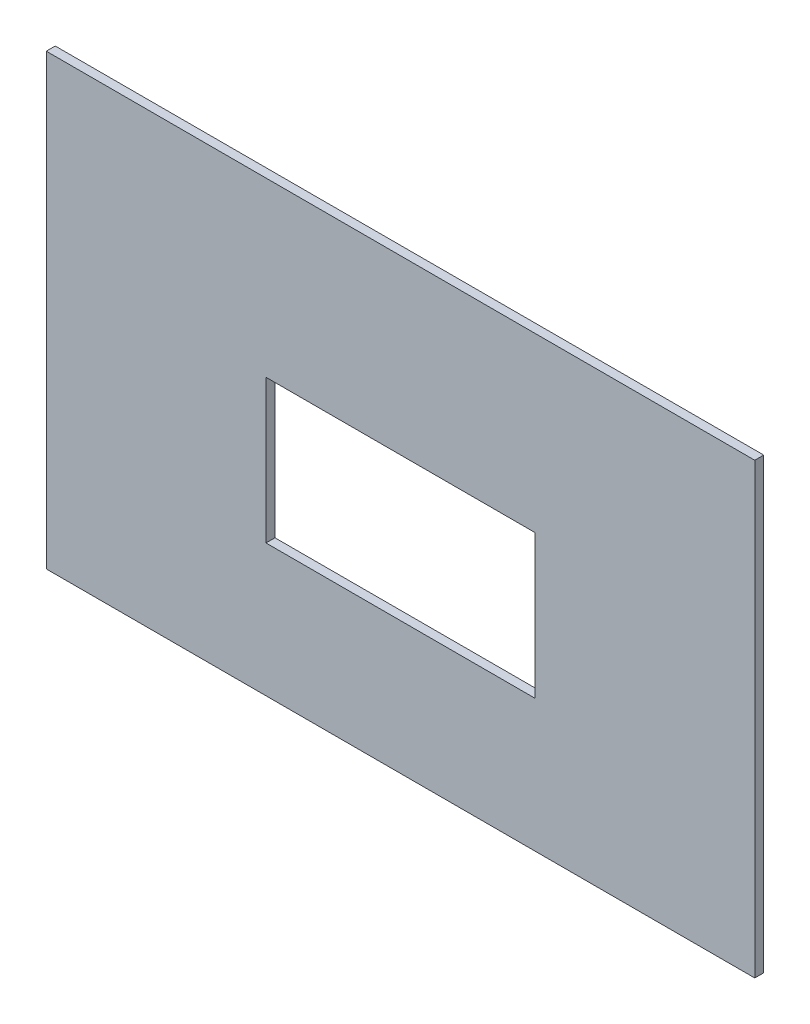
ISO-10303-21;
HEADER;
FILE_DESCRIPTION(('STEP AP214'),'2;1');
FILE_NAME('part.step','',(''),(''),'','','');
FILE_SCHEMA(('AUTOMOTIVE_DESIGN { 1 0 10303 214 1 1 1 1 }'));
ENDSEC;
DATA;
#1=APPLICATION_CONTEXT('core data for automotive mechanical design processes');
#2=APPLICATION_PROTOCOL_DEFINITION('international standard','automotive_design',2000,#1);
#3=PRODUCT_CONTEXT('',#1,'mechanical');
#4=PRODUCT('Part','Part','',(#3));
#5=PRODUCT_RELATED_PRODUCT_CATEGORY('part','',(#4));
#6=PRODUCT_DEFINITION_FORMATION('','',#4);
#7=PRODUCT_DEFINITION_CONTEXT('part definition',#1,'design');
#8=PRODUCT_DEFINITION('design','',#6,#7);
#9=PRODUCT_DEFINITION_SHAPE('','',#8);
#10=(LENGTH_UNIT() NAMED_UNIT(*) SI_UNIT(.MILLI.,.METRE.));
#11=(NAMED_UNIT(*) PLANE_ANGLE_UNIT() SI_UNIT($,.RADIAN.));
#12=(NAMED_UNIT(*) SI_UNIT($,.STERADIAN.) SOLID_ANGLE_UNIT());
#13=UNCERTAINTY_MEASURE_WITH_UNIT(LENGTH_MEASURE(1.E-05),#10,'distance_accuracy_value','');
#14=(GEOMETRIC_REPRESENTATION_CONTEXT(3) GLOBAL_UNCERTAINTY_ASSIGNED_CONTEXT((#13)) GLOBAL_UNIT_ASSIGNED_CONTEXT((#10,
#11,#12)) REPRESENTATION_CONTEXT('',''));
#15=CARTESIAN_POINT('',(0.,0.,0.));
#16=DIRECTION('',(0.,0.,1.));
#17=DIRECTION('',(1.,0.,0.));
#18=AXIS2_PLACEMENT_3D('',#15,#16,#17);
#19=CARTESIAN_POINT('',(-405.47263681592,195.273631840796,10.));
#20=DIRECTION('',(1.,0.,0.));
#21=DIRECTION('',(0.,0.,-1.));
#22=AXIS2_PLACEMENT_3D('',#19,#20,#21);
#23=PLANE('',#22);
#24=DIRECTION('',(0.,-1.,0.));
#25=VECTOR('',#24,1.);
#26=CARTESIAN_POINT('',(-405.47263681592,195.273631840796,0.));
#27=LINE('',#26,#25);
#28=CARTESIAN_POINT('',(-405.47263681592,195.273631840796,0.));
#29=VERTEX_POINT('',#28);
#30=CARTESIAN_POINT('',(-405.47263681592,-304.726368159204,0.));
#31=VERTEX_POINT('',#30);
#32=EDGE_CURVE('E147',#29,#31,#27,.T.);
#33=ORIENTED_EDGE('',*,*,#32,.T.);
#34=DIRECTION('',(0.,0.,-1.));
#35=VECTOR('',#34,1.);
#36=CARTESIAN_POINT('',(-405.47263681592,-304.726368159204,10.));
#37=LINE('',#36,#35);
#38=CARTESIAN_POINT('',(-405.47263681592,-304.726368159204,10.));
#39=VERTEX_POINT('',#38);
#40=EDGE_CURVE('E11',#39,#31,#37,.T.);
#41=ORIENTED_EDGE('',*,*,#40,.F.);
#42=DIRECTION('',(0.,-1.,0.));
#43=VECTOR('',#42,1.);
#44=CARTESIAN_POINT('',(-405.47263681592,195.273631840796,10.));
#45=LINE('',#44,#43);
#46=CARTESIAN_POINT('',(-405.47263681592,195.273631840796,10.));
#47=VERTEX_POINT('',#46);
#48=EDGE_CURVE('E153',#47,#39,#45,.T.);
#49=ORIENTED_EDGE('',*,*,#48,.F.);
#50=DIRECTION('',(0.,0.,-1.));
#51=VECTOR('',#50,1.);
#52=CARTESIAN_POINT('',(-405.47263681592,195.273631840796,10.));
#53=LINE('',#52,#51);
#54=EDGE_CURVE('E167',#47,#29,#53,.T.);
#55=ORIENTED_EDGE('',*,*,#54,.T.);
#56=EDGE_LOOP('',(#33,#41,#49,#55));
#57=FACE_BOUND('',#56,.T.);
#58=ADVANCED_FACE('F39',(#57),#23,.F.);
#59=CARTESIAN_POINT('',(-405.47263681592,-304.726368159204,10.));
#60=DIRECTION('',(0.,1.,0.));
#61=DIRECTION('',(-1.,0.,0.));
#62=AXIS2_PLACEMENT_3D('',#59,#60,#61);
#63=PLANE('',#62);
#64=DIRECTION('',(1.,0.,0.));
#65=VECTOR('',#64,1.);
#66=CARTESIAN_POINT('',(-405.47263681592,-304.726368159204,0.));
#67=LINE('',#66,#65);
#68=CARTESIAN_POINT('',(384.52736318408,-304.726368159204,0.));
#69=VERTEX_POINT('',#68);
#70=EDGE_CURVE('E171',#31,#69,#67,.T.);
#71=ORIENTED_EDGE('',*,*,#70,.T.);
#72=DIRECTION('',(0.,0.,-1.));
#73=VECTOR('',#72,1.);
#74=CARTESIAN_POINT('',(384.52736318408,-304.726368159204,10.));
#75=LINE('',#74,#73);
#76=CARTESIAN_POINT('',(384.52736318408,-304.726368159204,10.));
#77=VERTEX_POINT('',#76);
#78=EDGE_CURVE('E47',#77,#69,#75,.T.);
#79=ORIENTED_EDGE('',*,*,#78,.F.);
#80=DIRECTION('',(1.,0.,0.));
#81=VECTOR('',#80,1.);
#82=CARTESIAN_POINT('',(-405.47263681592,-304.726368159204,10.));
#83=LINE('',#82,#81);
#84=EDGE_CURVE('E157',#39,#77,#83,.T.);
#85=ORIENTED_EDGE('',*,*,#84,.F.);
#86=ORIENTED_EDGE('',*,*,#40,.T.);
#87=EDGE_LOOP('',(#71,#79,#85,#86));
#88=FACE_BOUND('',#87,.T.);
#89=ADVANCED_FACE('F205',(#88),#63,.F.);
#90=CARTESIAN_POINT('',(384.52736318408,195.273631840796,10.));
#91=DIRECTION('',(-1.,0.,0.));
#92=DIRECTION('',(0.,-1.,0.));
#93=AXIS2_PLACEMENT_3D('',#90,#91,#92);
#94=PLANE('',#93);
#95=DIRECTION('',(0.,1.,0.));
#96=VECTOR('',#95,1.);
#97=CARTESIAN_POINT('',(384.52736318408,195.273631840796,0.));
#98=LINE('',#97,#96);
#99=CARTESIAN_POINT('',(384.52736318408,195.273631840796,0.));
#100=VERTEX_POINT('',#99);
#101=EDGE_CURVE('E174',#69,#100,#98,.T.);
#102=ORIENTED_EDGE('',*,*,#101,.T.);
#103=DIRECTION('',(0.,0.,-1.));
#104=VECTOR('',#103,1.);
#105=CARTESIAN_POINT('',(384.52736318408,195.273631840796,10.));
#106=LINE('',#105,#104);
#107=CARTESIAN_POINT('',(384.52736318408,195.273631840796,10.));
#108=VERTEX_POINT('',#107);
#109=EDGE_CURVE('E182',#108,#100,#106,.T.);
#110=ORIENTED_EDGE('',*,*,#109,.F.);
#111=DIRECTION('',(0.,1.,0.));
#112=VECTOR('',#111,1.);
#113=CARTESIAN_POINT('',(384.52736318408,195.273631840796,10.));
#114=LINE('',#113,#112);
#115=EDGE_CURVE('E161',#77,#108,#114,.T.);
#116=ORIENTED_EDGE('',*,*,#115,.F.);
#117=ORIENTED_EDGE('',*,*,#78,.T.);
#118=EDGE_LOOP('',(#102,#110,#116,#117));
#119=FACE_BOUND('',#118,.T.);
#120=ADVANCED_FACE('F191',(#119),#94,.F.);
#121=CARTESIAN_POINT('',(-405.47263681592,195.273631840796,10.));
#122=DIRECTION('',(0.,-1.,0.));
#123=DIRECTION('',(0.,0.,-1.));
#124=AXIS2_PLACEMENT_3D('',#121,#122,#123);
#125=PLANE('',#124);
#126=DIRECTION('',(-1.,0.,0.));
#127=VECTOR('',#126,1.);
#128=CARTESIAN_POINT('',(-405.47263681592,195.273631840796,0.));
#129=LINE('',#128,#127);
#130=EDGE_CURVE('E158',#100,#29,#129,.T.);
#131=ORIENTED_EDGE('',*,*,#130,.T.);
#132=ORIENTED_EDGE('',*,*,#54,.F.);
#133=DIRECTION('',(-1.,0.,0.));
#134=VECTOR('',#133,1.);
#135=CARTESIAN_POINT('',(-405.47263681592,195.273631840796,10.));
#136=LINE('',#135,#134);
#137=EDGE_CURVE('E164',#108,#47,#136,.T.);
#138=ORIENTED_EDGE('',*,*,#137,.F.);
#139=ORIENTED_EDGE('',*,*,#109,.T.);
#140=EDGE_LOOP('',(#131,#132,#138,#139));
#141=FACE_BOUND('',#140,.T.);
#142=ADVANCED_FACE('F200',(#141),#125,.F.);
#143=CARTESIAN_POINT('',(0.,0.,10.));
#144=DIRECTION('',(0.,0.,1.));
#145=DIRECTION('',(1.,0.,0.));
#146=AXIS2_PLACEMENT_3D('',#143,#144,#145);
#147=PLANE('',#146);
#148=DIRECTION('',(0.,1.,0.));
#149=VECTOR('',#148,1.);
#150=CARTESIAN_POINT('',(-160.47263681592,2.87363184079621,10.));
#151=LINE('',#150,#149);
#152=CARTESIAN_POINT('',(-160.47263681592,-157.126368159204,10.));
#153=VERTEX_POINT('',#152);
#154=CARTESIAN_POINT('',(-160.47263681592,2.87363184079621,10.));
#155=VERTEX_POINT('',#154);
#156=EDGE_CURVE('E106',#153,#155,#151,.T.);
#157=ORIENTED_EDGE('',*,*,#156,.T.);
#158=DIRECTION('',(1.,0.,0.));
#159=VECTOR('',#158,1.);
#160=CARTESIAN_POINT('',(-160.47263681592,2.87363184079621,10.));
#161=LINE('',#160,#159);
#162=CARTESIAN_POINT('',(139.52736318408,2.87363184079621,10.));
#163=VERTEX_POINT('',#162);
#164=EDGE_CURVE('E116',#155,#163,#161,.T.);
#165=ORIENTED_EDGE('',*,*,#164,.T.);
#166=DIRECTION('',(0.,-1.,0.));
#167=VECTOR('',#166,1.);
#168=CARTESIAN_POINT('',(139.52736318408,2.87363184079621,10.));
#169=LINE('',#168,#167);
#170=CARTESIAN_POINT('',(139.52736318408,-157.126368159204,10.));
#171=VERTEX_POINT('',#170);
#172=EDGE_CURVE('E54',#163,#171,#169,.T.);
#173=ORIENTED_EDGE('',*,*,#172,.T.);
#174=DIRECTION('',(-1.,0.,0.));
#175=VECTOR('',#174,1.);
#176=CARTESIAN_POINT('',(-160.47263681592,-157.126368159204,10.));
#177=LINE('',#176,#175);
#178=EDGE_CURVE('E113',#171,#153,#177,.T.);
#179=ORIENTED_EDGE('',*,*,#178,.T.);
#180=EDGE_LOOP('',(#157,#165,#173,#179));
#181=FACE_BOUND('',#180,.T.);
#182=ORIENTED_EDGE('',*,*,#48,.T.);
#183=ORIENTED_EDGE('',*,*,#84,.T.);
#184=ORIENTED_EDGE('',*,*,#115,.T.);
#185=ORIENTED_EDGE('',*,*,#137,.T.);
#186=EDGE_LOOP('',(#182,#183,#184,#185));
#187=FACE_BOUND('',#186,.T.);
#188=ADVANCED_FACE('F121',(#181,#187),#147,.T.);
#189=CARTESIAN_POINT('',(0.,0.,0.));
#190=DIRECTION('',(0.,0.,1.));
#191=DIRECTION('',(1.,0.,0.));
#192=AXIS2_PLACEMENT_3D('',#189,#190,#191);
#193=PLANE('',#192);
#194=DIRECTION('',(1.,0.,0.));
#195=VECTOR('',#194,1.);
#196=CARTESIAN_POINT('',(-160.47263681592,2.87363184079621,0.));
#197=LINE('',#196,#195);
#198=CARTESIAN_POINT('',(-160.47263681592,2.87363184079621,0.));
#199=VERTEX_POINT('',#198);
#200=CARTESIAN_POINT('',(139.52736318408,2.87363184079621,0.));
#201=VERTEX_POINT('',#200);
#202=EDGE_CURVE('E138',#199,#201,#197,.T.);
#203=ORIENTED_EDGE('',*,*,#202,.F.);
#204=DIRECTION('',(0.,1.,0.));
#205=VECTOR('',#204,1.);
#206=CARTESIAN_POINT('',(-160.47263681592,2.87363184079621,0.));
#207=LINE('',#206,#205);
#208=CARTESIAN_POINT('',(-160.47263681592,-157.126368159204,0.));
#209=VERTEX_POINT('',#208);
#210=EDGE_CURVE('E62',#209,#199,#207,.T.);
#211=ORIENTED_EDGE('',*,*,#210,.F.);
#212=DIRECTION('',(-1.,0.,0.));
#213=VECTOR('',#212,1.);
#214=CARTESIAN_POINT('',(-160.47263681592,-157.126368159204,0.));
#215=LINE('',#214,#213);
#216=CARTESIAN_POINT('',(139.52736318408,-157.126368159204,0.));
#217=VERTEX_POINT('',#216);
#218=EDGE_CURVE('E125',#217,#209,#215,.T.);
#219=ORIENTED_EDGE('',*,*,#218,.F.);
#220=DIRECTION('',(0.,-1.,0.));
#221=VECTOR('',#220,1.);
#222=CARTESIAN_POINT('',(139.52736318408,2.87363184079621,0.));
#223=LINE('',#222,#221);
#224=EDGE_CURVE('E129',#201,#217,#223,.T.);
#225=ORIENTED_EDGE('',*,*,#224,.F.);
#226=EDGE_LOOP('',(#203,#211,#219,#225));
#227=FACE_BOUND('',#226,.T.);
#228=ORIENTED_EDGE('',*,*,#32,.F.);
#229=ORIENTED_EDGE('',*,*,#130,.F.);
#230=ORIENTED_EDGE('',*,*,#101,.F.);
#231=ORIENTED_EDGE('',*,*,#70,.F.);
#232=EDGE_LOOP('',(#228,#229,#230,#231));
#233=FACE_BOUND('',#232,.T.);
#234=ADVANCED_FACE('F197',(#227,#233),#193,.F.);
#235=CARTESIAN_POINT('',(-160.47263681592,2.87363184079621,10.));
#236=DIRECTION('',(-1.,0.,0.));
#237=DIRECTION('',(0.,0.,1.));
#238=AXIS2_PLACEMENT_3D('',#235,#236,#237);
#239=PLANE('',#238);
#240=ORIENTED_EDGE('',*,*,#210,.T.);
#241=DIRECTION('',(0.,0.,-1.));
#242=VECTOR('',#241,1.);
#243=CARTESIAN_POINT('',(-160.47263681592,2.87363184079621,10.));
#244=LINE('',#243,#242);
#245=EDGE_CURVE('E102',#155,#199,#244,.T.);
#246=ORIENTED_EDGE('',*,*,#245,.F.);
#247=ORIENTED_EDGE('',*,*,#156,.F.);
#248=DIRECTION('',(0.,0.,-1.));
#249=VECTOR('',#248,1.);
#250=CARTESIAN_POINT('',(-160.47263681592,-157.126368159204,10.));
#251=LINE('',#250,#249);
#252=EDGE_CURVE('E144',#153,#209,#251,.T.);
#253=ORIENTED_EDGE('',*,*,#252,.T.);
#254=EDGE_LOOP('',(#240,#246,#247,#253));
#255=FACE_BOUND('',#254,.T.);
#256=ADVANCED_FACE('F104',(#255),#239,.F.);
#257=CARTESIAN_POINT('',(-160.47263681592,-157.126368159204,10.));
#258=DIRECTION('',(0.,-1.,0.));
#259=DIRECTION('',(0.,0.,-1.));
#260=AXIS2_PLACEMENT_3D('',#257,#258,#259);
#261=PLANE('',#260);
#262=ORIENTED_EDGE('',*,*,#218,.T.);
#263=ORIENTED_EDGE('',*,*,#252,.F.);
#264=ORIENTED_EDGE('',*,*,#178,.F.);
#265=DIRECTION('',(0.,0.,-1.));
#266=VECTOR('',#265,1.);
#267=CARTESIAN_POINT('',(139.52736318408,-157.126368159204,10.));
#268=LINE('',#267,#266);
#269=EDGE_CURVE('E148',#171,#217,#268,.T.);
#270=ORIENTED_EDGE('',*,*,#269,.T.);
#271=EDGE_LOOP('',(#262,#263,#264,#270));
#272=FACE_BOUND('',#271,.T.);
#273=ADVANCED_FACE('F222',(#272),#261,.F.);
#274=CARTESIAN_POINT('',(139.52736318408,2.87363184079621,10.));
#275=DIRECTION('',(1.,0.,0.));
#276=DIRECTION('',(0.,0.,-1.));
#277=AXIS2_PLACEMENT_3D('',#274,#275,#276);
#278=PLANE('',#277);
#279=ORIENTED_EDGE('',*,*,#224,.T.);
#280=ORIENTED_EDGE('',*,*,#269,.F.);
#281=ORIENTED_EDGE('',*,*,#172,.F.);
#282=DIRECTION('',(0.,0.,-1.));
#283=VECTOR('',#282,1.);
#284=CARTESIAN_POINT('',(139.52736318408,2.87363184079621,10.));
#285=LINE('',#284,#283);
#286=EDGE_CURVE('E112',#163,#201,#285,.T.);
#287=ORIENTED_EDGE('',*,*,#286,.T.);
#288=EDGE_LOOP('',(#279,#280,#281,#287));
#289=FACE_BOUND('',#288,.T.);
#290=ADVANCED_FACE('F225',(#289),#278,.F.);
#291=CARTESIAN_POINT('',(-160.47263681592,2.87363184079621,10.));
#292=DIRECTION('',(0.,1.,0.));
#293=DIRECTION('',(0.,0.,1.));
#294=AXIS2_PLACEMENT_3D('',#291,#292,#293);
#295=PLANE('',#294);
#296=ORIENTED_EDGE('',*,*,#202,.T.);
#297=ORIENTED_EDGE('',*,*,#286,.F.);
#298=ORIENTED_EDGE('',*,*,#164,.F.);
#299=ORIENTED_EDGE('',*,*,#245,.T.);
#300=EDGE_LOOP('',(#296,#297,#298,#299));
#301=FACE_BOUND('',#300,.T.);
#302=ADVANCED_FACE('F117',(#301),#295,.F.);
#303=CLOSED_SHELL('',(#58,#89,#120,#142,#188,#234,#256,#273,#290,#302));
#304=MANIFOLD_SOLID_BREP('B2',#303);
#305=ADVANCED_BREP_SHAPE_REPRESENTATION('',(#18,#304),#14);
#306=SHAPE_DEFINITION_REPRESENTATION(#9,#305);
ENDSEC;
END-ISO-10303-21;
